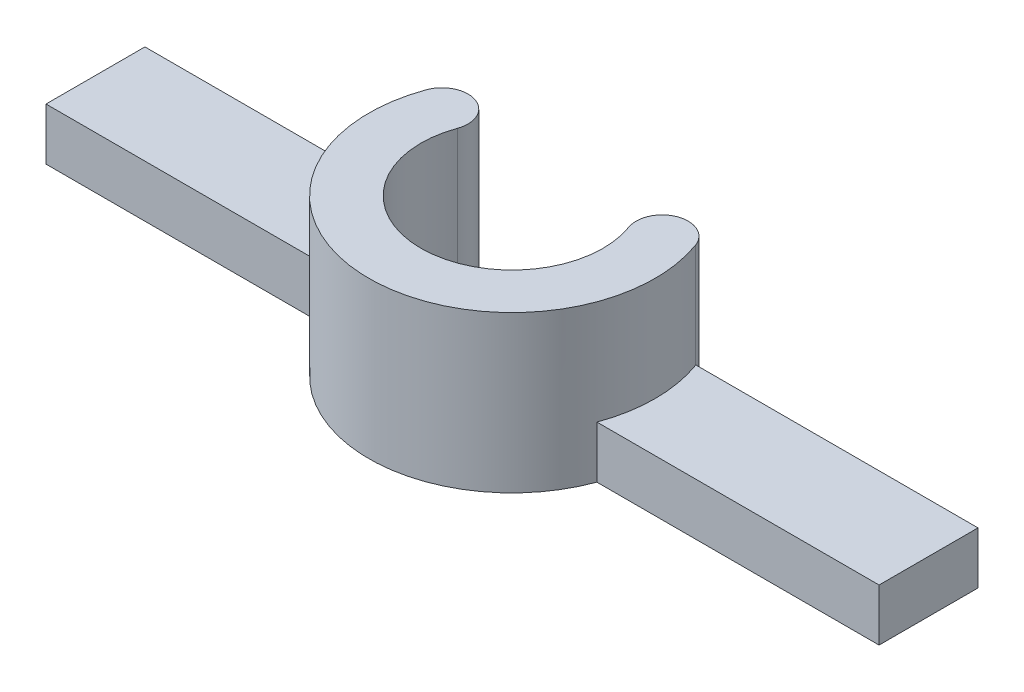
ISO-10303-21;
HEADER;
FILE_DESCRIPTION(('STEP AP214'),'2;1');
FILE_NAME('part.step','',(''),(''),'','','');
FILE_SCHEMA(('AUTOMOTIVE_DESIGN { 1 0 10303 214 1 1 1 1 }'));
ENDSEC;
DATA;
#1=APPLICATION_CONTEXT('core data for automotive mechanical design processes');
#2=APPLICATION_PROTOCOL_DEFINITION('international standard','automotive_design',2000,#1);
#3=PRODUCT_CONTEXT('',#1,'mechanical');
#4=PRODUCT('Part','Part','',(#3));
#5=PRODUCT_RELATED_PRODUCT_CATEGORY('part','',(#4));
#6=PRODUCT_DEFINITION_FORMATION('','',#4);
#7=PRODUCT_DEFINITION_CONTEXT('part definition',#1,'design');
#8=PRODUCT_DEFINITION('design','',#6,#7);
#9=PRODUCT_DEFINITION_SHAPE('','',#8);
#10=(LENGTH_UNIT() NAMED_UNIT(*) SI_UNIT(.MILLI.,.METRE.));
#11=(NAMED_UNIT(*) PLANE_ANGLE_UNIT() SI_UNIT($,.RADIAN.));
#12=(NAMED_UNIT(*) SI_UNIT($,.STERADIAN.) SOLID_ANGLE_UNIT());
#13=UNCERTAINTY_MEASURE_WITH_UNIT(LENGTH_MEASURE(1.E-05),#10,'distance_accuracy_value','');
#14=(GEOMETRIC_REPRESENTATION_CONTEXT(3) GLOBAL_UNCERTAINTY_ASSIGNED_CONTEXT((#13)) GLOBAL_UNIT_ASSIGNED_CONTEXT((#10,
#11,#12)) REPRESENTATION_CONTEXT('',''));
#15=CARTESIAN_POINT('',(0.,0.,0.));
#16=DIRECTION('',(0.,0.,1.));
#17=DIRECTION('',(1.,0.,0.));
#18=AXIS2_PLACEMENT_3D('',#15,#16,#17);
#19=CARTESIAN_POINT('',(4.22861679353659,6.,-1.53909064496551));
#20=DIRECTION('',(0.,-1.,0.));
#21=DIRECTION('',(0.,0.,-1.));
#22=AXIS2_PLACEMENT_3D('',#19,#20,#21);
#23=CYLINDRICAL_SURFACE('',#22,1.);
#24=DIRECTION('',(0.,-1.,0.));
#25=VECTOR('',#24,1.);
#26=CARTESIAN_POINT('',(5.16121769287595,6.,-1.9));
#27=LINE('',#26,#25);
#28=CARTESIAN_POINT('',(5.16121769287595,0.,-1.9));
#29=VERTEX_POINT('',#28);
#30=CARTESIAN_POINT('',(5.16121769287595,2.,-1.9));
#31=VERTEX_POINT('',#30);
#32=EDGE_CURVE('E148',#29,#31,#27,.F.);
#33=ORIENTED_EDGE('',*,*,#32,.F.);
#34=CARTESIAN_POINT('',(4.22861679353659,0.,-1.53909064496551));
#35=DIRECTION('',(0.,1.,0.));
#36=DIRECTION('',(0.,0.,1.));
#37=AXIS2_PLACEMENT_3D('',#34,#35,#36);
#38=CIRCLE('',#37,1.);
#39=CARTESIAN_POINT('',(3.28892417275068,0.,-1.19707050163984));
#40=VERTEX_POINT('',#39);
#41=EDGE_CURVE('E241',#29,#40,#38,.T.);
#42=ORIENTED_EDGE('',*,*,#41,.T.);
#43=DIRECTION('',(0.,-1.,0.));
#44=VECTOR('',#43,1.);
#45=CARTESIAN_POINT('',(3.28892417275068,6.,-1.19707050163984));
#46=LINE('',#45,#44);
#47=CARTESIAN_POINT('',(3.28892417275068,6.,-1.19707050163984));
#48=VERTEX_POINT('',#47);
#49=EDGE_CURVE('E250',#48,#40,#46,.T.);
#50=ORIENTED_EDGE('',*,*,#49,.F.);
#51=CARTESIAN_POINT('',(4.22861679353659,6.,-1.53909064496551));
#52=DIRECTION('',(0.,1.,0.));
#53=DIRECTION('',(0.,0.,1.));
#54=AXIS2_PLACEMENT_3D('',#51,#52,#53);
#55=CIRCLE('',#54,1.);
#56=CARTESIAN_POINT('',(5.16830941432249,6.,-1.88111078829118));
#57=VERTEX_POINT('',#56);
#58=EDGE_CURVE('E228',#57,#48,#55,.T.);
#59=ORIENTED_EDGE('',*,*,#58,.F.);
#60=DIRECTION('',(0.,-1.,0.));
#61=VECTOR('',#60,1.);
#62=CARTESIAN_POINT('',(5.16830941432249,6.,-1.88111078829118));
#63=LINE('',#62,#61);
#64=CARTESIAN_POINT('',(5.16830941432249,2.,-1.88111078829118));
#65=VERTEX_POINT('',#64);
#66=EDGE_CURVE('E254',#57,#65,#63,.T.);
#67=ORIENTED_EDGE('',*,*,#66,.T.);
#68=CARTESIAN_POINT('',(4.22861679353659,2.,-1.53909064496551));
#69=DIRECTION('',(0.,1.,0.));
#70=DIRECTION('',(0.,0.,1.));
#71=AXIS2_PLACEMENT_3D('',#68,#69,#70);
#72=CIRCLE('',#71,1.);
#73=EDGE_CURVE('E11',#65,#31,#72,.T.);
#74=ORIENTED_EDGE('',*,*,#73,.T.);
#75=EDGE_LOOP('',(#33,#42,#50,#59,#67,#74));
#76=FACE_BOUND('',#75,.T.);
#77=ADVANCED_FACE('F41',(#76),#23,.T.);
#78=CARTESIAN_POINT('',(0.,6.,0.));
#79=DIRECTION('',(0.,-1.,0.));
#80=DIRECTION('',(0.,0.,-1.));
#81=AXIS2_PLACEMENT_3D('',#78,#79,#80);
#82=CYLINDRICAL_SURFACE('',#81,5.5);
#83=CARTESIAN_POINT('',(0.,0.,0.));
#84=DIRECTION('',(0.,1.,0.));
#85=DIRECTION('',(0.,0.,1.));
#86=AXIS2_PLACEMENT_3D('',#83,#84,#85);
#87=CIRCLE('',#86,5.5);
#88=CARTESIAN_POINT('',(-5.16139516022557,0.,1.9));
#89=VERTEX_POINT('',#88);
#90=CARTESIAN_POINT('',(5.16139516022557,0.,1.9));
#91=VERTEX_POINT('',#90);
#92=EDGE_CURVE('E238',#89,#91,#87,.T.);
#93=ORIENTED_EDGE('',*,*,#92,.T.);
#94=DIRECTION('',(0.,-1.,0.));
#95=VECTOR('',#94,1.);
#96=CARTESIAN_POINT('',(5.16139516022557,6.,1.9));
#97=LINE('',#96,#95);
#98=CARTESIAN_POINT('',(5.16139516022557,2.,1.9));
#99=VERTEX_POINT('',#98);
#100=EDGE_CURVE('E57',#91,#99,#97,.F.);
#101=ORIENTED_EDGE('',*,*,#100,.T.);
#102=CARTESIAN_POINT('',(0.,2.,0.));
#103=DIRECTION('',(0.,1.,0.));
#104=DIRECTION('',(0.,0.,1.));
#105=AXIS2_PLACEMENT_3D('',#102,#103,#104);
#106=CIRCLE('',#105,5.5);
#107=EDGE_CURVE('E175',#99,#65,#106,.T.);
#108=ORIENTED_EDGE('',*,*,#107,.T.);
#109=ORIENTED_EDGE('',*,*,#66,.F.);
#110=CARTESIAN_POINT('',(0.,6.,0.));
#111=DIRECTION('',(0.,1.,0.));
#112=DIRECTION('',(0.,0.,1.));
#113=AXIS2_PLACEMENT_3D('',#110,#111,#112);
#114=CIRCLE('',#113,5.5);
#115=CARTESIAN_POINT('',(-5.1683094143225,6.,-1.88111078829118));
#116=VERTEX_POINT('',#115);
#117=EDGE_CURVE('E224',#116,#57,#114,.T.);
#118=ORIENTED_EDGE('',*,*,#117,.F.);
#119=DIRECTION('',(0.,-1.,0.));
#120=VECTOR('',#119,1.);
#121=CARTESIAN_POINT('',(-5.1683094143225,6.,-1.88111078829118));
#122=LINE('',#121,#120);
#123=CARTESIAN_POINT('',(-5.1683094143225,2.,-1.88111078829118));
#124=VERTEX_POINT('',#123);
#125=EDGE_CURVE('E257',#116,#124,#122,.T.);
#126=ORIENTED_EDGE('',*,*,#125,.T.);
#127=CARTESIAN_POINT('',(0.,2.,0.));
#128=DIRECTION('',(0.,1.,0.));
#129=DIRECTION('',(0.,0.,1.));
#130=AXIS2_PLACEMENT_3D('',#127,#128,#129);
#131=CIRCLE('',#130,5.5);
#132=CARTESIAN_POINT('',(-5.16139516022557,2.,1.9));
#133=VERTEX_POINT('',#132);
#134=EDGE_CURVE('E50',#124,#133,#131,.T.);
#135=ORIENTED_EDGE('',*,*,#134,.T.);
#136=DIRECTION('',(0.,-1.,0.));
#137=VECTOR('',#136,1.);
#138=CARTESIAN_POINT('',(-5.16139516022557,6.,1.9));
#139=LINE('',#138,#137);
#140=EDGE_CURVE('E207',#89,#133,#139,.F.);
#141=ORIENTED_EDGE('',*,*,#140,.F.);
#142=EDGE_LOOP('',(#93,#101,#108,#109,#118,#126,#135,#141));
#143=FACE_BOUND('',#142,.T.);
#144=ADVANCED_FACE('F263',(#143),#82,.T.);
#145=CARTESIAN_POINT('',(-4.22861679353659,6.,-1.53909064496551));
#146=DIRECTION('',(0.,-1.,0.));
#147=DIRECTION('',(0.,0.,-1.));
#148=AXIS2_PLACEMENT_3D('',#145,#146,#147);
#149=CYLINDRICAL_SURFACE('',#148,1.);
#150=DIRECTION('',(0.,-1.,0.));
#151=VECTOR('',#150,1.);
#152=CARTESIAN_POINT('',(-5.16121769287595,6.,-1.9));
#153=LINE('',#152,#151);
#154=CARTESIAN_POINT('',(-5.16121769287595,2.,-1.9));
#155=VERTEX_POINT('',#154);
#156=CARTESIAN_POINT('',(-5.16121769287595,0.,-1.9));
#157=VERTEX_POINT('',#156);
#158=EDGE_CURVE('E211',#155,#157,#153,.T.);
#159=ORIENTED_EDGE('',*,*,#158,.F.);
#160=CARTESIAN_POINT('',(-4.22861679353659,2.,-1.53909064496551));
#161=DIRECTION('',(0.,1.,0.));
#162=DIRECTION('',(0.,0.,1.));
#163=AXIS2_PLACEMENT_3D('',#160,#161,#162);
#164=CIRCLE('',#163,1.);
#165=EDGE_CURVE('E215',#124,#155,#164,.F.);
#166=ORIENTED_EDGE('',*,*,#165,.F.);
#167=ORIENTED_EDGE('',*,*,#125,.F.);
#168=CARTESIAN_POINT('',(-4.22861679353659,6.,-1.53909064496551));
#169=DIRECTION('',(0.,1.,0.));
#170=DIRECTION('',(0.,0.,1.));
#171=AXIS2_PLACEMENT_3D('',#168,#169,#170);
#172=CIRCLE('',#171,1.);
#173=CARTESIAN_POINT('',(-3.28892417275068,6.,-1.19707050163984));
#174=VERTEX_POINT('',#173);
#175=EDGE_CURVE('E220',#116,#174,#172,.F.);
#176=ORIENTED_EDGE('',*,*,#175,.T.);
#177=DIRECTION('',(0.,-1.,0.));
#178=VECTOR('',#177,1.);
#179=CARTESIAN_POINT('',(-3.28892417275068,6.,-1.19707050163984));
#180=LINE('',#179,#178);
#181=CARTESIAN_POINT('',(-3.28892417275068,0.,-1.19707050163984));
#182=VERTEX_POINT('',#181);
#183=EDGE_CURVE('E235',#174,#182,#180,.T.);
#184=ORIENTED_EDGE('',*,*,#183,.T.);
#185=CARTESIAN_POINT('',(-4.22861679353659,0.,-1.53909064496551));
#186=DIRECTION('',(0.,1.,0.));
#187=DIRECTION('',(0.,0.,1.));
#188=AXIS2_PLACEMENT_3D('',#185,#186,#187);
#189=CIRCLE('',#188,1.);
#190=EDGE_CURVE('E219',#157,#182,#189,.F.);
#191=ORIENTED_EDGE('',*,*,#190,.F.);
#192=EDGE_LOOP('',(#159,#166,#167,#176,#184,#191));
#193=FACE_BOUND('',#192,.T.);
#194=ADVANCED_FACE('F43',(#193),#149,.T.);
#195=CARTESIAN_POINT('',(0.,6.,0.));
#196=DIRECTION('',(0.,-1.,0.));
#197=DIRECTION('',(0.,0.,-1.));
#198=AXIS2_PLACEMENT_3D('',#195,#196,#197);
#199=CYLINDRICAL_SURFACE('',#198,3.5);
#200=CARTESIAN_POINT('',(0.,0.,0.));
#201=DIRECTION('',(0.,1.,0.));
#202=DIRECTION('',(0.,0.,1.));
#203=AXIS2_PLACEMENT_3D('',#200,#201,#202);
#204=CIRCLE('',#203,3.5);
#205=EDGE_CURVE('E225',#182,#40,#204,.T.);
#206=ORIENTED_EDGE('',*,*,#205,.F.);
#207=ORIENTED_EDGE('',*,*,#183,.F.);
#208=CARTESIAN_POINT('',(0.,6.,0.));
#209=DIRECTION('',(0.,1.,0.));
#210=DIRECTION('',(0.,0.,1.));
#211=AXIS2_PLACEMENT_3D('',#208,#209,#210);
#212=CIRCLE('',#211,3.5);
#213=EDGE_CURVE('E231',#174,#48,#212,.T.);
#214=ORIENTED_EDGE('',*,*,#213,.T.);
#215=ORIENTED_EDGE('',*,*,#49,.T.);
#216=EDGE_LOOP('',(#206,#207,#214,#215));
#217=FACE_BOUND('',#216,.T.);
#218=ADVANCED_FACE('F291',(#217),#199,.F.);
#219=CARTESIAN_POINT('',(0.,6.,0.));
#220=DIRECTION('',(0.,1.,0.));
#221=DIRECTION('',(0.,0.,1.));
#222=AXIS2_PLACEMENT_3D('',#219,#220,#221);
#223=PLANE('',#222);
#224=ORIENTED_EDGE('',*,*,#175,.F.);
#225=ORIENTED_EDGE('',*,*,#117,.T.);
#226=ORIENTED_EDGE('',*,*,#58,.T.);
#227=ORIENTED_EDGE('',*,*,#213,.F.);
#228=EDGE_LOOP('',(#224,#225,#226,#227));
#229=FACE_BOUND('',#228,.T.);
#230=ADVANCED_FACE('F294',(#229),#223,.T.);
#231=CARTESIAN_POINT('',(0.,0.,0.));
#232=DIRECTION('',(0.,1.,0.));
#233=DIRECTION('',(0.,0.,1.));
#234=AXIS2_PLACEMENT_3D('',#231,#232,#233);
#235=PLANE('',#234);
#236=ORIENTED_EDGE('',*,*,#41,.F.);
#237=DIRECTION('',(-1.,0.,0.));
#238=VECTOR('',#237,1.);
#239=CARTESIAN_POINT('',(0.,0.,-1.9));
#240=LINE('',#239,#238);
#241=CARTESIAN_POINT('',(16.,0.,-1.9));
#242=VERTEX_POINT('',#241);
#243=EDGE_CURVE('E160',#242,#29,#240,.T.);
#244=ORIENTED_EDGE('',*,*,#243,.F.);
#245=DIRECTION('',(0.,0.,1.));
#246=VECTOR('',#245,1.);
#247=CARTESIAN_POINT('',(16.,0.,0.));
#248=LINE('',#247,#246);
#249=CARTESIAN_POINT('',(16.,0.,1.9));
#250=VERTEX_POINT('',#249);
#251=EDGE_CURVE('E138',#242,#250,#248,.T.);
#252=ORIENTED_EDGE('',*,*,#251,.T.);
#253=DIRECTION('',(-1.,0.,0.));
#254=VECTOR('',#253,1.);
#255=CARTESIAN_POINT('',(0.,0.,1.9));
#256=LINE('',#255,#254);
#257=EDGE_CURVE('E156',#250,#91,#256,.T.);
#258=ORIENTED_EDGE('',*,*,#257,.T.);
#259=ORIENTED_EDGE('',*,*,#92,.F.);
#260=DIRECTION('',(1.,0.,0.));
#261=VECTOR('',#260,1.);
#262=CARTESIAN_POINT('',(0.,0.,1.9));
#263=LINE('',#262,#261);
#264=CARTESIAN_POINT('',(-16.,0.,1.9));
#265=VERTEX_POINT('',#264);
#266=EDGE_CURVE('E184',#265,#89,#263,.T.);
#267=ORIENTED_EDGE('',*,*,#266,.F.);
#268=DIRECTION('',(0.,0.,1.));
#269=VECTOR('',#268,1.);
#270=CARTESIAN_POINT('',(-16.,0.,0.));
#271=LINE('',#270,#269);
#272=CARTESIAN_POINT('',(-16.,0.,-1.9));
#273=VERTEX_POINT('',#272);
#274=EDGE_CURVE('E195',#273,#265,#271,.T.);
#275=ORIENTED_EDGE('',*,*,#274,.F.);
#276=DIRECTION('',(1.,0.,0.));
#277=VECTOR('',#276,1.);
#278=CARTESIAN_POINT('',(0.,0.,-1.9));
#279=LINE('',#278,#277);
#280=EDGE_CURVE('E178',#273,#157,#279,.T.);
#281=ORIENTED_EDGE('',*,*,#280,.T.);
#282=ORIENTED_EDGE('',*,*,#190,.T.);
#283=ORIENTED_EDGE('',*,*,#205,.T.);
#284=EDGE_LOOP('',(#236,#244,#252,#258,#259,#267,#275,#281,#282,#283));
#285=FACE_BOUND('',#284,.T.);
#286=ADVANCED_FACE('F278',(#285),#235,.F.);
#287=CARTESIAN_POINT('',(0.,2.,0.));
#288=DIRECTION('',(0.,1.,0.));
#289=DIRECTION('',(0.,0.,1.));
#290=AXIS2_PLACEMENT_3D('',#287,#288,#289);
#291=PLANE('',#290);
#292=ORIENTED_EDGE('',*,*,#134,.F.);
#293=ORIENTED_EDGE('',*,*,#165,.T.);
#294=DIRECTION('',(1.,0.,0.));
#295=VECTOR('',#294,1.);
#296=CARTESIAN_POINT('',(0.,2.,-1.9));
#297=LINE('',#296,#295);
#298=CARTESIAN_POINT('',(-16.,2.,-1.9));
#299=VERTEX_POINT('',#298);
#300=EDGE_CURVE('E179',#299,#155,#297,.T.);
#301=ORIENTED_EDGE('',*,*,#300,.F.);
#302=DIRECTION('',(0.,0.,1.));
#303=VECTOR('',#302,1.);
#304=CARTESIAN_POINT('',(-16.,2.,0.));
#305=LINE('',#304,#303);
#306=CARTESIAN_POINT('',(-16.,2.,1.9));
#307=VERTEX_POINT('',#306);
#308=EDGE_CURVE('E183',#299,#307,#305,.T.);
#309=ORIENTED_EDGE('',*,*,#308,.T.);
#310=DIRECTION('',(1.,0.,0.));
#311=VECTOR('',#310,1.);
#312=CARTESIAN_POINT('',(0.,2.,1.9));
#313=LINE('',#312,#311);
#314=EDGE_CURVE('E187',#307,#133,#313,.T.);
#315=ORIENTED_EDGE('',*,*,#314,.T.);
#316=EDGE_LOOP('',(#292,#293,#301,#309,#315));
#317=FACE_BOUND('',#316,.T.);
#318=ADVANCED_FACE('F270',(#317),#291,.T.);
#319=CARTESIAN_POINT('',(0.,2.,1.9));
#320=DIRECTION('',(0.,0.,-1.));
#321=DIRECTION('',(-1.,0.,0.));
#322=AXIS2_PLACEMENT_3D('',#319,#320,#321);
#323=PLANE('',#322);
#324=ORIENTED_EDGE('',*,*,#266,.T.);
#325=ORIENTED_EDGE('',*,*,#140,.T.);
#326=ORIENTED_EDGE('',*,*,#314,.F.);
#327=DIRECTION('',(0.,-1.,0.));
#328=VECTOR('',#327,1.);
#329=CARTESIAN_POINT('',(-16.,2.,1.9));
#330=LINE('',#329,#328);
#331=EDGE_CURVE('E191',#307,#265,#330,.T.);
#332=ORIENTED_EDGE('',*,*,#331,.T.);
#333=EDGE_LOOP('',(#324,#325,#326,#332));
#334=FACE_BOUND('',#333,.T.);
#335=ADVANCED_FACE('F268',(#334),#323,.F.);
#336=CARTESIAN_POINT('',(0.,2.,-1.9));
#337=DIRECTION('',(0.,0.,-1.));
#338=DIRECTION('',(-1.,0.,0.));
#339=AXIS2_PLACEMENT_3D('',#336,#337,#338);
#340=PLANE('',#339);
#341=ORIENTED_EDGE('',*,*,#300,.T.);
#342=ORIENTED_EDGE('',*,*,#158,.T.);
#343=ORIENTED_EDGE('',*,*,#280,.F.);
#344=DIRECTION('',(0.,-1.,0.));
#345=VECTOR('',#344,1.);
#346=CARTESIAN_POINT('',(-16.,2.,-1.9));
#347=LINE('',#346,#345);
#348=EDGE_CURVE('E204',#299,#273,#347,.T.);
#349=ORIENTED_EDGE('',*,*,#348,.F.);
#350=EDGE_LOOP('',(#341,#342,#343,#349));
#351=FACE_BOUND('',#350,.T.);
#352=ADVANCED_FACE('F301',(#351),#340,.T.);
#353=CARTESIAN_POINT('',(-16.,2.,0.));
#354=DIRECTION('',(1.,0.,0.));
#355=DIRECTION('',(0.,0.,-1.));
#356=AXIS2_PLACEMENT_3D('',#353,#354,#355);
#357=PLANE('',#356);
#358=ORIENTED_EDGE('',*,*,#274,.T.);
#359=ORIENTED_EDGE('',*,*,#331,.F.);
#360=ORIENTED_EDGE('',*,*,#308,.F.);
#361=ORIENTED_EDGE('',*,*,#348,.T.);
#362=EDGE_LOOP('',(#358,#359,#360,#361));
#363=FACE_BOUND('',#362,.T.);
#364=ADVANCED_FACE('F275',(#363),#357,.F.);
#365=CARTESIAN_POINT('',(0.,2.,-1.9));
#366=DIRECTION('',(0.,0.,1.));
#367=DIRECTION('',(1.,0.,0.));
#368=AXIS2_PLACEMENT_3D('',#365,#366,#367);
#369=PLANE('',#368);
#370=ORIENTED_EDGE('',*,*,#243,.T.);
#371=ORIENTED_EDGE('',*,*,#32,.T.);
#372=DIRECTION('',(-1.,0.,0.));
#373=VECTOR('',#372,1.);
#374=CARTESIAN_POINT('',(0.,2.,-1.9));
#375=LINE('',#374,#373);
#376=CARTESIAN_POINT('',(16.,2.,-1.9));
#377=VERTEX_POINT('',#376);
#378=EDGE_CURVE('E146',#377,#31,#375,.T.);
#379=ORIENTED_EDGE('',*,*,#378,.F.);
#380=DIRECTION('',(0.,-1.,0.));
#381=VECTOR('',#380,1.);
#382=CARTESIAN_POINT('',(16.,2.,-1.9));
#383=LINE('',#382,#381);
#384=EDGE_CURVE('E131',#377,#242,#383,.T.);
#385=ORIENTED_EDGE('',*,*,#384,.T.);
#386=EDGE_LOOP('',(#370,#371,#379,#385));
#387=FACE_BOUND('',#386,.T.);
#388=ADVANCED_FACE('F147',(#387),#369,.F.);
#389=CARTESIAN_POINT('',(0.,2.,1.9));
#390=DIRECTION('',(0.,0.,1.));
#391=DIRECTION('',(1.,0.,0.));
#392=AXIS2_PLACEMENT_3D('',#389,#390,#391);
#393=PLANE('',#392);
#394=ORIENTED_EDGE('',*,*,#100,.F.);
#395=ORIENTED_EDGE('',*,*,#257,.F.);
#396=DIRECTION('',(0.,-1.,0.));
#397=VECTOR('',#396,1.);
#398=CARTESIAN_POINT('',(16.,2.,1.9));
#399=LINE('',#398,#397);
#400=CARTESIAN_POINT('',(16.,2.,1.9));
#401=VERTEX_POINT('',#400);
#402=EDGE_CURVE('E143',#401,#250,#399,.T.);
#403=ORIENTED_EDGE('',*,*,#402,.F.);
#404=DIRECTION('',(-1.,0.,0.));
#405=VECTOR('',#404,1.);
#406=CARTESIAN_POINT('',(0.,2.,1.9));
#407=LINE('',#406,#405);
#408=EDGE_CURVE('E151',#401,#99,#407,.T.);
#409=ORIENTED_EDGE('',*,*,#408,.T.);
#410=EDGE_LOOP('',(#394,#395,#403,#409));
#411=FACE_BOUND('',#410,.T.);
#412=ADVANCED_FACE('F282',(#411),#393,.T.);
#413=CARTESIAN_POINT('',(16.,2.,0.));
#414=DIRECTION('',(1.,0.,0.));
#415=DIRECTION('',(0.,0.,-1.));
#416=AXIS2_PLACEMENT_3D('',#413,#414,#415);
#417=PLANE('',#416);
#418=ORIENTED_EDGE('',*,*,#251,.F.);
#419=ORIENTED_EDGE('',*,*,#384,.F.);
#420=DIRECTION('',(0.,0.,1.));
#421=VECTOR('',#420,1.);
#422=CARTESIAN_POINT('',(16.,2.,0.));
#423=LINE('',#422,#421);
#424=EDGE_CURVE('E135',#377,#401,#423,.T.);
#425=ORIENTED_EDGE('',*,*,#424,.T.);
#426=ORIENTED_EDGE('',*,*,#402,.T.);
#427=EDGE_LOOP('',(#418,#419,#425,#426));
#428=FACE_BOUND('',#427,.T.);
#429=ADVANCED_FACE('F133',(#428),#417,.T.);
#430=CARTESIAN_POINT('',(0.,2.,0.));
#431=DIRECTION('',(0.,1.,0.));
#432=DIRECTION('',(0.,0.,1.));
#433=AXIS2_PLACEMENT_3D('',#430,#431,#432);
#434=PLANE('',#433);
#435=ORIENTED_EDGE('',*,*,#107,.F.);
#436=ORIENTED_EDGE('',*,*,#408,.F.);
#437=ORIENTED_EDGE('',*,*,#424,.F.);
#438=ORIENTED_EDGE('',*,*,#378,.T.);
#439=ORIENTED_EDGE('',*,*,#73,.F.);
#440=EDGE_LOOP('',(#435,#436,#437,#438,#439));
#441=FACE_BOUND('',#440,.T.);
#442=ADVANCED_FACE('F153',(#441),#434,.T.);
#443=CLOSED_SHELL('',(#77,#144,#194,#218,#230,#286,#318,#335,#352,#364,#388,#412,#429,#442));
#444=MANIFOLD_SOLID_BREP('B2',#443);
#445=ADVANCED_BREP_SHAPE_REPRESENTATION('',(#18,#444),#14);
#446=SHAPE_DEFINITION_REPRESENTATION(#9,#445);
ENDSEC;
END-ISO-10303-21;
